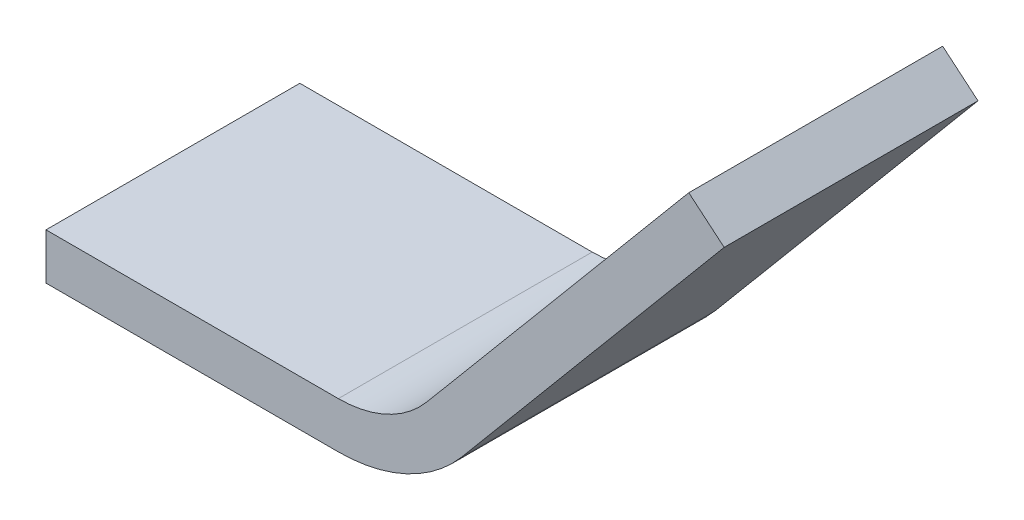
ISO-10303-21;
HEADER;
FILE_DESCRIPTION(('STEP AP214'),'2;1');
FILE_NAME('part.step','',(''),(''),'','','');
FILE_SCHEMA(('AUTOMOTIVE_DESIGN { 1 0 10303 214 1 1 1 1 }'));
ENDSEC;
DATA;
#1=APPLICATION_CONTEXT('core data for automotive mechanical design processes');
#2=APPLICATION_PROTOCOL_DEFINITION('international standard','automotive_design',2000,#1);
#3=PRODUCT_CONTEXT('',#1,'mechanical');
#4=PRODUCT('Part','Part','',(#3));
#5=PRODUCT_RELATED_PRODUCT_CATEGORY('part','',(#4));
#6=PRODUCT_DEFINITION_FORMATION('','',#4);
#7=PRODUCT_DEFINITION_CONTEXT('part definition',#1,'design');
#8=PRODUCT_DEFINITION('design','',#6,#7);
#9=PRODUCT_DEFINITION_SHAPE('','',#8);
#10=(LENGTH_UNIT() NAMED_UNIT(*) SI_UNIT(.MILLI.,.METRE.));
#11=(NAMED_UNIT(*) PLANE_ANGLE_UNIT() SI_UNIT($,.RADIAN.));
#12=(NAMED_UNIT(*) SI_UNIT($,.STERADIAN.) SOLID_ANGLE_UNIT());
#13=UNCERTAINTY_MEASURE_WITH_UNIT(LENGTH_MEASURE(1.E-05),#10,'distance_accuracy_value','');
#14=(GEOMETRIC_REPRESENTATION_CONTEXT(3) GLOBAL_UNCERTAINTY_ASSIGNED_CONTEXT((#13)) GLOBAL_UNIT_ASSIGNED_CONTEXT((#10,
#11,#12)) REPRESENTATION_CONTEXT('',''));
#15=CARTESIAN_POINT('',(0.,0.,0.));
#16=DIRECTION('',(0.,0.,1.));
#17=DIRECTION('',(1.,0.,0.));
#18=AXIS2_PLACEMENT_3D('',#15,#16,#17);
#19=CARTESIAN_POINT('',(0.606154562211569,0.100097346438839,2.2));
#20=DIRECTION('',(-0.766044443118975,0.642787609686543,0.));
#21=DIRECTION('',(-0.642787609686543,-0.766044443118975,0.));
#22=AXIS2_PLACEMENT_3D('',#19,#20,#21);
#23=PLANE('',#22);
#24=DIRECTION('',(0.642787609686543,0.766044443118975,0.));
#25=VECTOR('',#24,1.);
#26=CARTESIAN_POINT('',(0.606154562211569,0.100097346438839,0.));
#27=LINE('',#26,#25);
#28=CARTESIAN_POINT('',(0.606154562211569,0.100097346438839,0.));
#29=VERTEX_POINT('',#28);
#30=CARTESIAN_POINT('',(2.87756821599376,2.80706272860128,0.));
#31=VERTEX_POINT('',#30);
#32=EDGE_CURVE('E131',#29,#31,#27,.T.);
#33=ORIENTED_EDGE('',*,*,#32,.T.);
#34=DIRECTION('',(0.,0.,-1.));
#35=VECTOR('',#34,1.);
#36=CARTESIAN_POINT('',(2.87756821599376,2.80706272860128,2.2));
#37=LINE('',#36,#35);
#38=CARTESIAN_POINT('',(2.87756821599376,2.80706272860128,2.2));
#39=VERTEX_POINT('',#38);
#40=EDGE_CURVE('E11',#39,#31,#37,.T.);
#41=ORIENTED_EDGE('',*,*,#40,.F.);
#42=DIRECTION('',(0.642787609686543,0.766044443118975,0.));
#43=VECTOR('',#42,1.);
#44=CARTESIAN_POINT('',(0.606154562211569,0.100097346438839,2.2));
#45=LINE('',#44,#43);
#46=CARTESIAN_POINT('',(0.606154562211569,0.100097346438839,2.2));
#47=VERTEX_POINT('',#46);
#48=EDGE_CURVE('E89',#47,#39,#45,.T.);
#49=ORIENTED_EDGE('',*,*,#48,.F.);
#50=DIRECTION('',(0.,0.,-1.));
#51=VECTOR('',#50,1.);
#52=CARTESIAN_POINT('',(0.606154562211569,0.100097346438839,2.2));
#53=LINE('',#52,#51);
#54=EDGE_CURVE('E130',#47,#29,#53,.T.);
#55=ORIENTED_EDGE('',*,*,#54,.T.);
#56=EDGE_LOOP('',(#33,#41,#49,#55));
#57=FACE_BOUND('',#56,.T.);
#58=ADVANCED_FACE('F34',(#57),#23,.F.);
#59=CARTESIAN_POINT('',(2.57115043874617,3.0641777724759,2.2));
#60=DIRECTION('',(0.64278760968654,0.766044443118977,0.));
#61=DIRECTION('',(-0.766044443118977,0.642787609686541,0.));
#62=AXIS2_PLACEMENT_3D('',#59,#60,#61);
#63=PLANE('',#62);
#64=DIRECTION('',(0.766044443118977,-0.64278760968654,0.));
#65=VECTOR('',#64,1.);
#66=CARTESIAN_POINT('',(2.57115043874617,3.0641777724759,0.));
#67=LINE('',#66,#65);
#68=CARTESIAN_POINT('',(2.57115043874617,3.0641777724759,0.));
#69=VERTEX_POINT('',#68);
#70=EDGE_CURVE('E134',#69,#31,#67,.T.);
#71=ORIENTED_EDGE('',*,*,#70,.F.);
#72=DIRECTION('',(0.,0.,-1.));
#73=VECTOR('',#72,1.);
#74=CARTESIAN_POINT('',(2.57115043874617,3.0641777724759,2.2));
#75=LINE('',#74,#73);
#76=CARTESIAN_POINT('',(2.57115043874617,3.0641777724759,2.2));
#77=VERTEX_POINT('',#76);
#78=EDGE_CURVE('E42',#77,#69,#75,.T.);
#79=ORIENTED_EDGE('',*,*,#78,.F.);
#80=DIRECTION('',(0.766044443118977,-0.64278760968654,0.));
#81=VECTOR('',#80,1.);
#82=CARTESIAN_POINT('',(2.57115043874617,3.0641777724759,2.2));
#83=LINE('',#82,#81);
#84=EDGE_CURVE('E173',#77,#39,#83,.T.);
#85=ORIENTED_EDGE('',*,*,#84,.T.);
#86=ORIENTED_EDGE('',*,*,#40,.T.);
#87=EDGE_LOOP('',(#71,#79,#85,#86));
#88=FACE_BOUND('',#87,.T.);
#89=ADVANCED_FACE('F164',(#88),#63,.T.);
#90=CARTESIAN_POINT('',(0.299736784963979,0.357212390313457,2.2));
#91=DIRECTION('',(-0.766044443118975,0.642787609686543,0.));
#92=DIRECTION('',(-0.642787609686543,-0.766044443118975,0.));
#93=AXIS2_PLACEMENT_3D('',#90,#91,#92);
#94=PLANE('',#93);
#95=DIRECTION('',(0.642787609686543,0.766044443118975,0.));
#96=VECTOR('',#95,1.);
#97=CARTESIAN_POINT('',(0.299736784963979,0.357212390313457,0.));
#98=LINE('',#97,#96);
#99=CARTESIAN_POINT('',(0.299736784963979,0.357212390313456,0.));
#100=VERTEX_POINT('',#99);
#101=EDGE_CURVE('E137',#100,#69,#98,.T.);
#102=ORIENTED_EDGE('',*,*,#101,.F.);
#103=DIRECTION('',(0.,0.,-1.));
#104=VECTOR('',#103,1.);
#105=CARTESIAN_POINT('',(0.299736784963979,0.357212390313456,2.2));
#106=LINE('',#105,#104);
#107=CARTESIAN_POINT('',(0.299736784963979,0.357212390313456,2.2));
#108=VERTEX_POINT('',#107);
#109=EDGE_CURVE('E154',#108,#100,#106,.T.);
#110=ORIENTED_EDGE('',*,*,#109,.F.);
#111=DIRECTION('',(0.642787609686543,0.766044443118975,0.));
#112=VECTOR('',#111,1.);
#113=CARTESIAN_POINT('',(0.299736784963979,0.357212390313457,2.2));
#114=LINE('',#113,#112);
#115=EDGE_CURVE('E161',#108,#77,#114,.T.);
#116=ORIENTED_EDGE('',*,*,#115,.T.);
#117=ORIENTED_EDGE('',*,*,#78,.T.);
#118=EDGE_LOOP('',(#102,#110,#116,#117));
#119=FACE_BOUND('',#118,.T.);
#120=ADVANCED_FACE('F159',(#119),#94,.T.);
#121=CARTESIAN_POINT('',(-0.466307658154995,1.,2.2));
#122=DIRECTION('',(0.,0.,-1.));
#123=DIRECTION('',(-1.,0.,0.));
#124=AXIS2_PLACEMENT_3D('',#121,#122,#123);
#125=CYLINDRICAL_SURFACE('',#124,1.);
#126=CARTESIAN_POINT('',(-0.466307658154995,1.,0.));
#127=DIRECTION('',(0.,0.,1.));
#128=DIRECTION('',(1.,0.,0.));
#129=AXIS2_PLACEMENT_3D('',#126,#127,#128);
#130=CIRCLE('',#129,1.);
#131=CARTESIAN_POINT('',(-0.466307658154995,0.,0.));
#132=VERTEX_POINT('',#131);
#133=EDGE_CURVE('E140',#132,#100,#130,.T.);
#134=ORIENTED_EDGE('',*,*,#133,.F.);
#135=DIRECTION('',(0.,0.,-1.));
#136=VECTOR('',#135,1.);
#137=CARTESIAN_POINT('',(-0.466307658154995,0.,2.2));
#138=LINE('',#137,#136);
#139=CARTESIAN_POINT('',(-0.466307658154995,0.,2.2));
#140=VERTEX_POINT('',#139);
#141=EDGE_CURVE('E152',#140,#132,#138,.T.);
#142=ORIENTED_EDGE('',*,*,#141,.F.);
#143=CARTESIAN_POINT('',(-0.466307658154995,1.,2.2));
#144=DIRECTION('',(0.,0.,1.));
#145=DIRECTION('',(1.,0.,0.));
#146=AXIS2_PLACEMENT_3D('',#143,#144,#145);
#147=CIRCLE('',#146,1.);
#148=EDGE_CURVE('E125',#140,#108,#147,.T.);
#149=ORIENTED_EDGE('',*,*,#148,.T.);
#150=ORIENTED_EDGE('',*,*,#109,.T.);
#151=EDGE_LOOP('',(#134,#142,#149,#150));
#152=FACE_BOUND('',#151,.T.);
#153=ADVANCED_FACE('F171',(#152),#125,.F.);
#154=CARTESIAN_POINT('',(-0.466307658154995,0.,2.2));
#155=DIRECTION('',(0.,1.,0.));
#156=DIRECTION('',(-1.,0.,0.));
#157=AXIS2_PLACEMENT_3D('',#154,#155,#156);
#158=PLANE('',#157);
#159=DIRECTION('',(1.,0.,0.));
#160=VECTOR('',#159,1.);
#161=CARTESIAN_POINT('',(-0.466307658154995,0.,0.));
#162=LINE('',#161,#160);
#163=CARTESIAN_POINT('',(-3.,0.,0.));
#164=VERTEX_POINT('',#163);
#165=EDGE_CURVE('E143',#164,#132,#162,.T.);
#166=ORIENTED_EDGE('',*,*,#165,.F.);
#167=DIRECTION('',(0.,0.,-1.));
#168=VECTOR('',#167,1.);
#169=CARTESIAN_POINT('',(-3.,0.,2.2));
#170=LINE('',#169,#168);
#171=CARTESIAN_POINT('',(-3.,0.,2.2));
#172=VERTEX_POINT('',#171);
#173=EDGE_CURVE('E113',#172,#164,#170,.T.);
#174=ORIENTED_EDGE('',*,*,#173,.F.);
#175=DIRECTION('',(1.,0.,0.));
#176=VECTOR('',#175,1.);
#177=CARTESIAN_POINT('',(-0.466307658154995,0.,2.2));
#178=LINE('',#177,#176);
#179=EDGE_CURVE('E123',#172,#140,#178,.T.);
#180=ORIENTED_EDGE('',*,*,#179,.T.);
#181=ORIENTED_EDGE('',*,*,#141,.T.);
#182=EDGE_LOOP('',(#166,#174,#180,#181));
#183=FACE_BOUND('',#182,.T.);
#184=ADVANCED_FACE('F178',(#183),#158,.T.);
#185=CARTESIAN_POINT('',(-3.,-0.4,2.2));
#186=DIRECTION('',(-1.,0.,0.));
#187=DIRECTION('',(0.,0.,1.));
#188=AXIS2_PLACEMENT_3D('',#185,#186,#187);
#189=PLANE('',#188);
#190=DIRECTION('',(0.,1.,0.));
#191=VECTOR('',#190,1.);
#192=CARTESIAN_POINT('',(-3.,-0.4,0.));
#193=LINE('',#192,#191);
#194=CARTESIAN_POINT('',(-3.,-0.4,0.));
#195=VERTEX_POINT('',#194);
#196=EDGE_CURVE('E112',#195,#164,#193,.T.);
#197=ORIENTED_EDGE('',*,*,#196,.F.);
#198=DIRECTION('',(0.,0.,-1.));
#199=VECTOR('',#198,1.);
#200=CARTESIAN_POINT('',(-3.,-0.4,2.2));
#201=LINE('',#200,#199);
#202=CARTESIAN_POINT('',(-3.,-0.4,2.2));
#203=VERTEX_POINT('',#202);
#204=EDGE_CURVE('E106',#203,#195,#201,.T.);
#205=ORIENTED_EDGE('',*,*,#204,.F.);
#206=DIRECTION('',(0.,1.,0.));
#207=VECTOR('',#206,1.);
#208=CARTESIAN_POINT('',(-3.,-0.4,2.2));
#209=LINE('',#208,#207);
#210=EDGE_CURVE('E110',#203,#172,#209,.T.);
#211=ORIENTED_EDGE('',*,*,#210,.T.);
#212=ORIENTED_EDGE('',*,*,#173,.T.);
#213=EDGE_LOOP('',(#197,#205,#211,#212));
#214=FACE_BOUND('',#213,.T.);
#215=ADVANCED_FACE('F108',(#214),#189,.T.);
#216=CARTESIAN_POINT('',(-0.466307658154995,-0.4,2.2));
#217=DIRECTION('',(0.,1.,0.));
#218=DIRECTION('',(-1.,0.,0.));
#219=AXIS2_PLACEMENT_3D('',#216,#217,#218);
#220=PLANE('',#219);
#221=DIRECTION('',(1.,0.,0.));
#222=VECTOR('',#221,1.);
#223=CARTESIAN_POINT('',(-0.466307658154995,-0.4,0.));
#224=LINE('',#223,#222);
#225=CARTESIAN_POINT('',(-0.466307658154996,-0.4,0.));
#226=VERTEX_POINT('',#225);
#227=EDGE_CURVE('E77',#195,#226,#224,.T.);
#228=ORIENTED_EDGE('',*,*,#227,.T.);
#229=DIRECTION('',(0.,0.,-1.));
#230=VECTOR('',#229,1.);
#231=CARTESIAN_POINT('',(-0.466307658154996,-0.4,2.2));
#232=LINE('',#231,#230);
#233=CARTESIAN_POINT('',(-0.466307658154996,-0.4,2.2));
#234=VERTEX_POINT('',#233);
#235=EDGE_CURVE('E114',#234,#226,#232,.T.);
#236=ORIENTED_EDGE('',*,*,#235,.F.);
#237=DIRECTION('',(1.,0.,0.));
#238=VECTOR('',#237,1.);
#239=CARTESIAN_POINT('',(-0.466307658154995,-0.4,2.2));
#240=LINE('',#239,#238);
#241=EDGE_CURVE('E116',#203,#234,#240,.T.);
#242=ORIENTED_EDGE('',*,*,#241,.F.);
#243=ORIENTED_EDGE('',*,*,#204,.T.);
#244=EDGE_LOOP('',(#228,#236,#242,#243));
#245=FACE_BOUND('',#244,.T.);
#246=ADVANCED_FACE('F117',(#245),#220,.F.);
#247=CARTESIAN_POINT('',(-0.466307658154995,1.,2.2));
#248=DIRECTION('',(0.,0.,-1.));
#249=DIRECTION('',(-1.,0.,0.));
#250=AXIS2_PLACEMENT_3D('',#247,#248,#249);
#251=CYLINDRICAL_SURFACE('',#250,1.4);
#252=CARTESIAN_POINT('',(-0.466307658154995,1.,0.));
#253=DIRECTION('',(0.,0.,1.));
#254=DIRECTION('',(1.,0.,0.));
#255=AXIS2_PLACEMENT_3D('',#252,#253,#254);
#256=CIRCLE('',#255,1.4);
#257=EDGE_CURVE('E83',#226,#29,#256,.T.);
#258=ORIENTED_EDGE('',*,*,#257,.T.);
#259=ORIENTED_EDGE('',*,*,#54,.F.);
#260=CARTESIAN_POINT('',(-0.466307658154995,1.,2.2));
#261=DIRECTION('',(0.,0.,1.));
#262=DIRECTION('',(1.,0.,0.));
#263=AXIS2_PLACEMENT_3D('',#260,#261,#262);
#264=CIRCLE('',#263,1.4);
#265=EDGE_CURVE('E50',#234,#47,#264,.T.);
#266=ORIENTED_EDGE('',*,*,#265,.F.);
#267=ORIENTED_EDGE('',*,*,#235,.T.);
#268=EDGE_LOOP('',(#258,#259,#266,#267));
#269=FACE_BOUND('',#268,.T.);
#270=ADVANCED_FACE('F180',(#269),#251,.T.);
#271=CARTESIAN_POINT('',(-0.466307658154995,1.,2.2));
#272=DIRECTION('',(0.,0.,1.));
#273=DIRECTION('',(1.,0.,0.));
#274=AXIS2_PLACEMENT_3D('',#271,#272,#273);
#275=PLANE('',#274);
#276=ORIENTED_EDGE('',*,*,#48,.T.);
#277=ORIENTED_EDGE('',*,*,#84,.F.);
#278=ORIENTED_EDGE('',*,*,#115,.F.);
#279=ORIENTED_EDGE('',*,*,#148,.F.);
#280=ORIENTED_EDGE('',*,*,#179,.F.);
#281=ORIENTED_EDGE('',*,*,#210,.F.);
#282=ORIENTED_EDGE('',*,*,#241,.T.);
#283=ORIENTED_EDGE('',*,*,#265,.T.);
#284=EDGE_LOOP('',(#276,#277,#278,#279,#280,#281,#282,#283));
#285=FACE_BOUND('',#284,.T.);
#286=ADVANCED_FACE('F120',(#285),#275,.T.);
#287=CARTESIAN_POINT('',(-0.466307658154995,1.,0.));
#288=DIRECTION('',(0.,0.,1.));
#289=DIRECTION('',(1.,0.,0.));
#290=AXIS2_PLACEMENT_3D('',#287,#288,#289);
#291=PLANE('',#290);
#292=ORIENTED_EDGE('',*,*,#32,.F.);
#293=ORIENTED_EDGE('',*,*,#257,.F.);
#294=ORIENTED_EDGE('',*,*,#227,.F.);
#295=ORIENTED_EDGE('',*,*,#196,.T.);
#296=ORIENTED_EDGE('',*,*,#165,.T.);
#297=ORIENTED_EDGE('',*,*,#133,.T.);
#298=ORIENTED_EDGE('',*,*,#101,.T.);
#299=ORIENTED_EDGE('',*,*,#70,.T.);
#300=EDGE_LOOP('',(#292,#293,#294,#295,#296,#297,#298,#299));
#301=FACE_BOUND('',#300,.T.);
#302=ADVANCED_FACE('F167',(#301),#291,.F.);
#303=CLOSED_SHELL('',(#58,#89,#120,#153,#184,#215,#246,#270,#286,#302));
#304=MANIFOLD_SOLID_BREP('B2',#303);
#305=ADVANCED_BREP_SHAPE_REPRESENTATION('',(#18,#304),#14);
#306=SHAPE_DEFINITION_REPRESENTATION(#9,#305);
ENDSEC;
END-ISO-10303-21;
